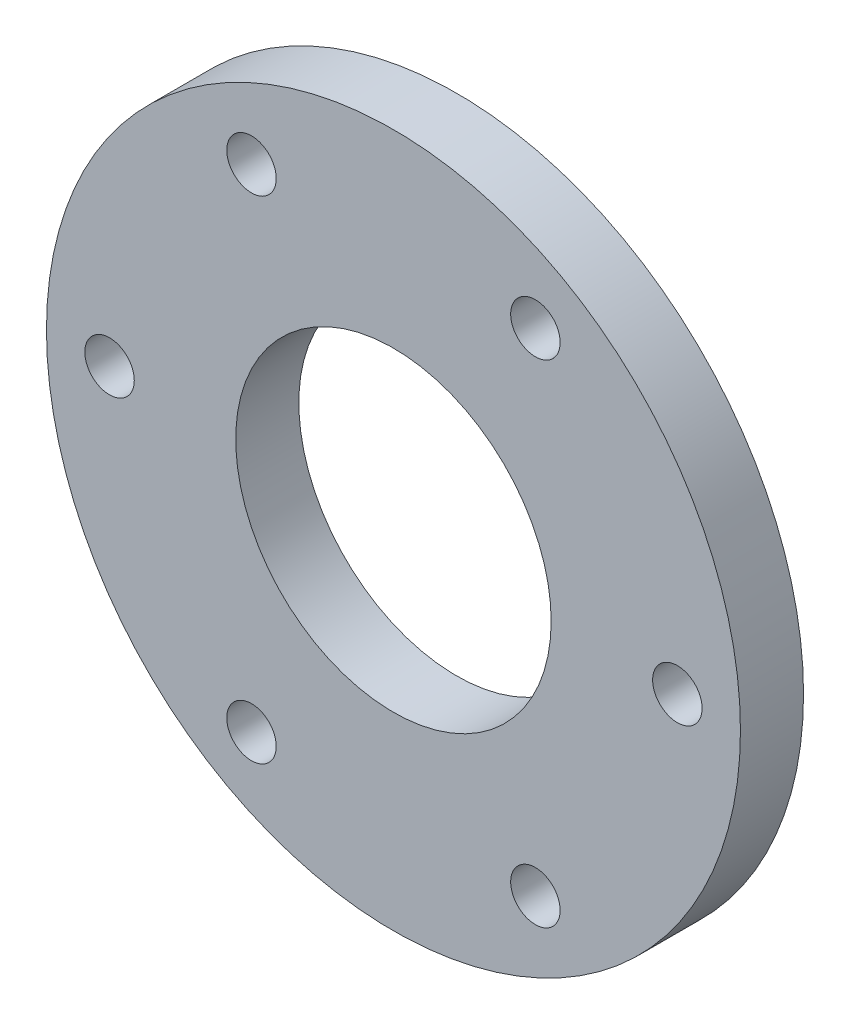
ISO-10303-21;
HEADER;
FILE_DESCRIPTION(('STEP AP214'),'2;1');
FILE_NAME('part.step','',(''),(''),'','','');
FILE_SCHEMA(('AUTOMOTIVE_DESIGN { 1 0 10303 214 1 1 1 1 }'));
ENDSEC;
DATA;
#1=APPLICATION_CONTEXT('core data for automotive mechanical design processes');
#2=APPLICATION_PROTOCOL_DEFINITION('international standard','automotive_design',2000,#1);
#3=PRODUCT_CONTEXT('',#1,'mechanical');
#4=PRODUCT('Part','Part','',(#3));
#5=PRODUCT_RELATED_PRODUCT_CATEGORY('part','',(#4));
#6=PRODUCT_DEFINITION_FORMATION('','',#4);
#7=PRODUCT_DEFINITION_CONTEXT('part definition',#1,'design');
#8=PRODUCT_DEFINITION('design','',#6,#7);
#9=PRODUCT_DEFINITION_SHAPE('','',#8);
#10=(LENGTH_UNIT() NAMED_UNIT(*) SI_UNIT(.MILLI.,.METRE.));
#11=(NAMED_UNIT(*) PLANE_ANGLE_UNIT() SI_UNIT($,.RADIAN.));
#12=(NAMED_UNIT(*) SI_UNIT($,.STERADIAN.) SOLID_ANGLE_UNIT());
#13=UNCERTAINTY_MEASURE_WITH_UNIT(LENGTH_MEASURE(1.E-05),#10,'distance_accuracy_value','');
#14=(GEOMETRIC_REPRESENTATION_CONTEXT(3) GLOBAL_UNCERTAINTY_ASSIGNED_CONTEXT((#13)) GLOBAL_UNIT_ASSIGNED_CONTEXT((#10,
#11,#12)) REPRESENTATION_CONTEXT('',''));
#15=CARTESIAN_POINT('',(0.,0.,0.));
#16=DIRECTION('',(0.,0.,1.));
#17=DIRECTION('',(1.,0.,0.));
#18=AXIS2_PLACEMENT_3D('',#15,#16,#17);
#19=CARTESIAN_POINT('',(0.,0.,3.175));
#20=DIRECTION('',(0.,0.,1.));
#21=DIRECTION('',(1.,0.,0.));
#22=AXIS2_PLACEMENT_3D('',#19,#20,#21);
#23=PLANE('',#22);
#24=CARTESIAN_POINT('',(14.2875,24.7466759131403,3.175));
#25=DIRECTION('',(0.,0.,1.));
#26=DIRECTION('',(1.,0.,0.));
#27=AXIS2_PLACEMENT_3D('',#24,#25,#26);
#28=CIRCLE('',#27,2.4892);
#29=CARTESIAN_POINT('',(16.7767,24.7466759131403,3.175));
#30=VERTEX_POINT('',#29);
#31=EDGE_CURVE('E73',#30,#30,#28,.T.);
#32=ORIENTED_EDGE('',*,*,#31,.F.);
#33=EDGE_LOOP('',(#32));
#34=FACE_BOUND('',#33,.T.);
#35=CARTESIAN_POINT('',(14.2875,-24.7466759131404,3.175));
#36=DIRECTION('',(0.,0.,1.));
#37=DIRECTION('',(1.,0.,0.));
#38=AXIS2_PLACEMENT_3D('',#35,#36,#37);
#39=CIRCLE('',#38,2.4892);
#40=CARTESIAN_POINT('',(16.7767,-24.7466759131404,3.175));
#41=VERTEX_POINT('',#40);
#42=EDGE_CURVE('E61',#41,#41,#39,.T.);
#43=ORIENTED_EDGE('',*,*,#42,.F.);
#44=EDGE_LOOP('',(#43));
#45=FACE_BOUND('',#44,.T.);
#46=CARTESIAN_POINT('',(-28.575,0.,3.175));
#47=DIRECTION('',(0.,0.,1.));
#48=DIRECTION('',(1.,0.,0.));
#49=AXIS2_PLACEMENT_3D('',#46,#47,#48);
#50=CIRCLE('',#49,2.4892);
#51=CARTESIAN_POINT('',(-26.0858,0.,3.175));
#52=VERTEX_POINT('',#51);
#53=EDGE_CURVE('E49',#52,#52,#50,.T.);
#54=ORIENTED_EDGE('',*,*,#53,.F.);
#55=EDGE_LOOP('',(#54));
#56=FACE_BOUND('',#55,.T.);
#57=CARTESIAN_POINT('',(0.,0.,3.175));
#58=DIRECTION('',(0.,0.,1.));
#59=DIRECTION('',(1.,0.,0.));
#60=AXIS2_PLACEMENT_3D('',#57,#58,#59);
#61=CIRCLE('',#60,34.925);
#62=CARTESIAN_POINT('',(34.925,0.,3.175));
#63=VERTEX_POINT('',#62);
#64=EDGE_CURVE('E10',#63,#63,#61,.T.);
#65=ORIENTED_EDGE('',*,*,#64,.T.);
#66=EDGE_LOOP('',(#65));
#67=FACE_BOUND('',#66,.T.);
#68=CARTESIAN_POINT('',(0.,0.,3.175));
#69=DIRECTION('',(0.,0.,1.));
#70=DIRECTION('',(1.,0.,0.));
#71=AXIS2_PLACEMENT_3D('',#68,#69,#70);
#72=CIRCLE('',#71,15.875);
#73=CARTESIAN_POINT('',(15.875,0.,3.175));
#74=VERTEX_POINT('',#73);
#75=EDGE_CURVE('E44',#74,#74,#72,.T.);
#76=ORIENTED_EDGE('',*,*,#75,.F.);
#77=EDGE_LOOP('',(#76));
#78=FACE_BOUND('',#77,.T.);
#79=CARTESIAN_POINT('',(-14.2875,-24.7466759131403,3.175));
#80=DIRECTION('',(0.,0.,1.));
#81=DIRECTION('',(1.,0.,0.));
#82=AXIS2_PLACEMENT_3D('',#79,#80,#81);
#83=CIRCLE('',#82,2.4892);
#84=CARTESIAN_POINT('',(-11.7983,-24.7466759131403,3.175));
#85=VERTEX_POINT('',#84);
#86=EDGE_CURVE('E55',#85,#85,#83,.T.);
#87=ORIENTED_EDGE('',*,*,#86,.F.);
#88=EDGE_LOOP('',(#87));
#89=FACE_BOUND('',#88,.T.);
#90=CARTESIAN_POINT('',(28.575,0.,3.175));
#91=DIRECTION('',(0.,0.,1.));
#92=DIRECTION('',(1.,0.,0.));
#93=AXIS2_PLACEMENT_3D('',#90,#91,#92);
#94=CIRCLE('',#93,2.4892);
#95=CARTESIAN_POINT('',(31.0642,0.,3.175));
#96=VERTEX_POINT('',#95);
#97=EDGE_CURVE('E67',#96,#96,#94,.T.);
#98=ORIENTED_EDGE('',*,*,#97,.F.);
#99=EDGE_LOOP('',(#98));
#100=FACE_BOUND('',#99,.T.);
#101=CARTESIAN_POINT('',(-14.2875,24.7466759131403,3.175));
#102=DIRECTION('',(0.,0.,1.));
#103=DIRECTION('',(1.,0.,0.));
#104=AXIS2_PLACEMENT_3D('',#101,#102,#103);
#105=CIRCLE('',#104,2.4892);
#106=CARTESIAN_POINT('',(-11.7983,24.7466759131403,3.175));
#107=VERTEX_POINT('',#106);
#108=EDGE_CURVE('E79',#107,#107,#105,.T.);
#109=ORIENTED_EDGE('',*,*,#108,.F.);
#110=EDGE_LOOP('',(#109));
#111=FACE_BOUND('',#110,.T.);
#112=ADVANCED_FACE('F33',(#34,#45,#56,#67,#78,#89,#100,#111),#23,.T.);
#113=CARTESIAN_POINT('',(0.,0.,-3.175));
#114=DIRECTION('',(0.,0.,1.));
#115=DIRECTION('',(1.,0.,0.));
#116=AXIS2_PLACEMENT_3D('',#113,#114,#115);
#117=PLANE('',#116);
#118=CARTESIAN_POINT('',(0.,0.,-3.175));
#119=DIRECTION('',(0.,0.,1.));
#120=DIRECTION('',(1.,0.,0.));
#121=AXIS2_PLACEMENT_3D('',#118,#119,#120);
#122=CIRCLE('',#121,34.925);
#123=CARTESIAN_POINT('',(34.925,0.,-3.175));
#124=VERTEX_POINT('',#123);
#125=EDGE_CURVE('E37',#124,#124,#122,.T.);
#126=ORIENTED_EDGE('',*,*,#125,.F.);
#127=EDGE_LOOP('',(#126));
#128=FACE_BOUND('',#127,.T.);
#129=CARTESIAN_POINT('',(0.,0.,-3.175));
#130=DIRECTION('',(0.,0.,1.));
#131=DIRECTION('',(1.,0.,0.));
#132=AXIS2_PLACEMENT_3D('',#129,#130,#131);
#133=CIRCLE('',#132,15.875);
#134=CARTESIAN_POINT('',(15.875,0.,-3.175));
#135=VERTEX_POINT('',#134);
#136=EDGE_CURVE('E46',#135,#135,#133,.T.);
#137=ORIENTED_EDGE('',*,*,#136,.T.);
#138=EDGE_LOOP('',(#137));
#139=FACE_BOUND('',#138,.T.);
#140=CARTESIAN_POINT('',(-28.575,0.,-3.175));
#141=DIRECTION('',(0.,0.,1.));
#142=DIRECTION('',(1.,0.,0.));
#143=AXIS2_PLACEMENT_3D('',#140,#141,#142);
#144=CIRCLE('',#143,2.4892);
#145=CARTESIAN_POINT('',(-26.0858,0.,-3.175));
#146=VERTEX_POINT('',#145);
#147=EDGE_CURVE('E52',#146,#146,#144,.T.);
#148=ORIENTED_EDGE('',*,*,#147,.T.);
#149=EDGE_LOOP('',(#148));
#150=FACE_BOUND('',#149,.T.);
#151=CARTESIAN_POINT('',(-14.2875,-24.7466759131403,-3.175));
#152=DIRECTION('',(0.,0.,1.));
#153=DIRECTION('',(1.,0.,0.));
#154=AXIS2_PLACEMENT_3D('',#151,#152,#153);
#155=CIRCLE('',#154,2.4892);
#156=CARTESIAN_POINT('',(-11.7983,-24.7466759131403,-3.175));
#157=VERTEX_POINT('',#156);
#158=EDGE_CURVE('E58',#157,#157,#155,.T.);
#159=ORIENTED_EDGE('',*,*,#158,.T.);
#160=EDGE_LOOP('',(#159));
#161=FACE_BOUND('',#160,.T.);
#162=CARTESIAN_POINT('',(14.2875,-24.7466759131404,-3.175));
#163=DIRECTION('',(0.,0.,1.));
#164=DIRECTION('',(1.,0.,0.));
#165=AXIS2_PLACEMENT_3D('',#162,#163,#164);
#166=CIRCLE('',#165,2.4892);
#167=CARTESIAN_POINT('',(16.7767,-24.7466759131404,-3.175));
#168=VERTEX_POINT('',#167);
#169=EDGE_CURVE('E64',#168,#168,#166,.T.);
#170=ORIENTED_EDGE('',*,*,#169,.T.);
#171=EDGE_LOOP('',(#170));
#172=FACE_BOUND('',#171,.T.);
#173=CARTESIAN_POINT('',(28.575,0.,-3.175));
#174=DIRECTION('',(0.,0.,1.));
#175=DIRECTION('',(1.,0.,0.));
#176=AXIS2_PLACEMENT_3D('',#173,#174,#175);
#177=CIRCLE('',#176,2.4892);
#178=CARTESIAN_POINT('',(31.0642,0.,-3.175));
#179=VERTEX_POINT('',#178);
#180=EDGE_CURVE('E70',#179,#179,#177,.T.);
#181=ORIENTED_EDGE('',*,*,#180,.T.);
#182=EDGE_LOOP('',(#181));
#183=FACE_BOUND('',#182,.T.);
#184=CARTESIAN_POINT('',(14.2875,24.7466759131403,-3.175));
#185=DIRECTION('',(0.,0.,1.));
#186=DIRECTION('',(1.,0.,0.));
#187=AXIS2_PLACEMENT_3D('',#184,#185,#186);
#188=CIRCLE('',#187,2.4892);
#189=CARTESIAN_POINT('',(16.7767,24.7466759131403,-3.175));
#190=VERTEX_POINT('',#189);
#191=EDGE_CURVE('E76',#190,#190,#188,.T.);
#192=ORIENTED_EDGE('',*,*,#191,.T.);
#193=EDGE_LOOP('',(#192));
#194=FACE_BOUND('',#193,.T.);
#195=CARTESIAN_POINT('',(-14.2875,24.7466759131403,-3.175));
#196=DIRECTION('',(0.,0.,1.));
#197=DIRECTION('',(1.,0.,0.));
#198=AXIS2_PLACEMENT_3D('',#195,#196,#197);
#199=CIRCLE('',#198,2.4892);
#200=CARTESIAN_POINT('',(-11.7983,24.7466759131403,-3.175));
#201=VERTEX_POINT('',#200);
#202=EDGE_CURVE('E82',#201,#201,#199,.T.);
#203=ORIENTED_EDGE('',*,*,#202,.T.);
#204=EDGE_LOOP('',(#203));
#205=FACE_BOUND('',#204,.T.);
#206=ADVANCED_FACE('F92',(#128,#139,#150,#161,#172,#183,#194,#205),#117,.F.);
#207=CARTESIAN_POINT('',(0.,0.,3.175));
#208=DIRECTION('',(0.,0.,-1.));
#209=DIRECTION('',(-1.,0.,0.));
#210=AXIS2_PLACEMENT_3D('',#207,#208,#209);
#211=CYLINDRICAL_SURFACE('',#210,34.925);
#212=ORIENTED_EDGE('',*,*,#64,.F.);
#213=EDGE_LOOP('',(#212));
#214=FACE_BOUND('',#213,.T.);
#215=ORIENTED_EDGE('',*,*,#125,.T.);
#216=EDGE_LOOP('',(#215));
#217=FACE_BOUND('',#216,.T.);
#218=ADVANCED_FACE('F35',(#214,#217),#211,.T.);
#219=CARTESIAN_POINT('',(0.,0.,3.175));
#220=DIRECTION('',(0.,0.,-1.));
#221=DIRECTION('',(-1.,0.,0.));
#222=AXIS2_PLACEMENT_3D('',#219,#220,#221);
#223=CYLINDRICAL_SURFACE('',#222,15.875);
#224=ORIENTED_EDGE('',*,*,#75,.T.);
#225=EDGE_LOOP('',(#224));
#226=FACE_BOUND('',#225,.T.);
#227=ORIENTED_EDGE('',*,*,#136,.F.);
#228=EDGE_LOOP('',(#227));
#229=FACE_BOUND('',#228,.T.);
#230=ADVANCED_FACE('F102',(#226,#229),#223,.F.);
#231=CARTESIAN_POINT('',(-28.575,0.,3.175));
#232=DIRECTION('',(0.,0.,-1.));
#233=DIRECTION('',(-1.,0.,0.));
#234=AXIS2_PLACEMENT_3D('',#231,#232,#233);
#235=CYLINDRICAL_SURFACE('',#234,2.4892);
#236=ORIENTED_EDGE('',*,*,#53,.T.);
#237=EDGE_LOOP('',(#236));
#238=FACE_BOUND('',#237,.T.);
#239=ORIENTED_EDGE('',*,*,#147,.F.);
#240=EDGE_LOOP('',(#239));
#241=FACE_BOUND('',#240,.T.);
#242=ADVANCED_FACE('F105',(#238,#241),#235,.F.);
#243=CARTESIAN_POINT('',(-14.2875,-24.7466759131403,3.175));
#244=DIRECTION('',(0.,0.,-1.));
#245=DIRECTION('',(-1.,0.,0.));
#246=AXIS2_PLACEMENT_3D('',#243,#244,#245);
#247=CYLINDRICAL_SURFACE('',#246,2.4892);
#248=ORIENTED_EDGE('',*,*,#86,.T.);
#249=EDGE_LOOP('',(#248));
#250=FACE_BOUND('',#249,.T.);
#251=ORIENTED_EDGE('',*,*,#158,.F.);
#252=EDGE_LOOP('',(#251));
#253=FACE_BOUND('',#252,.T.);
#254=ADVANCED_FACE('F109',(#250,#253),#247,.F.);
#255=CARTESIAN_POINT('',(14.2875,-24.7466759131404,3.175));
#256=DIRECTION('',(0.,0.,-1.));
#257=DIRECTION('',(-1.,0.,0.));
#258=AXIS2_PLACEMENT_3D('',#255,#256,#257);
#259=CYLINDRICAL_SURFACE('',#258,2.4892);
#260=ORIENTED_EDGE('',*,*,#42,.T.);
#261=EDGE_LOOP('',(#260));
#262=FACE_BOUND('',#261,.T.);
#263=ORIENTED_EDGE('',*,*,#169,.F.);
#264=EDGE_LOOP('',(#263));
#265=FACE_BOUND('',#264,.T.);
#266=ADVANCED_FACE('F113',(#262,#265),#259,.F.);
#267=CARTESIAN_POINT('',(28.575,0.,3.175));
#268=DIRECTION('',(0.,0.,-1.));
#269=DIRECTION('',(-1.,0.,0.));
#270=AXIS2_PLACEMENT_3D('',#267,#268,#269);
#271=CYLINDRICAL_SURFACE('',#270,2.4892);
#272=ORIENTED_EDGE('',*,*,#97,.T.);
#273=EDGE_LOOP('',(#272));
#274=FACE_BOUND('',#273,.T.);
#275=ORIENTED_EDGE('',*,*,#180,.F.);
#276=EDGE_LOOP('',(#275));
#277=FACE_BOUND('',#276,.T.);
#278=ADVANCED_FACE('F117',(#274,#277),#271,.F.);
#279=CARTESIAN_POINT('',(14.2875,24.7466759131403,3.175));
#280=DIRECTION('',(0.,0.,-1.));
#281=DIRECTION('',(-1.,0.,0.));
#282=AXIS2_PLACEMENT_3D('',#279,#280,#281);
#283=CYLINDRICAL_SURFACE('',#282,2.4892);
#284=ORIENTED_EDGE('',*,*,#31,.T.);
#285=EDGE_LOOP('',(#284));
#286=FACE_BOUND('',#285,.T.);
#287=ORIENTED_EDGE('',*,*,#191,.F.);
#288=EDGE_LOOP('',(#287));
#289=FACE_BOUND('',#288,.T.);
#290=ADVANCED_FACE('F121',(#286,#289),#283,.F.);
#291=CARTESIAN_POINT('',(-14.2875,24.7466759131403,3.175));
#292=DIRECTION('',(0.,0.,-1.));
#293=DIRECTION('',(-1.,0.,0.));
#294=AXIS2_PLACEMENT_3D('',#291,#292,#293);
#295=CYLINDRICAL_SURFACE('',#294,2.4892);
#296=ORIENTED_EDGE('',*,*,#108,.T.);
#297=EDGE_LOOP('',(#296));
#298=FACE_BOUND('',#297,.T.);
#299=ORIENTED_EDGE('',*,*,#202,.F.);
#300=EDGE_LOOP('',(#299));
#301=FACE_BOUND('',#300,.T.);
#302=ADVANCED_FACE('F88',(#298,#301),#295,.F.);
#303=CLOSED_SHELL('',(#112,#206,#218,#230,#242,#254,#266,#278,#290,#302));
#304=MANIFOLD_SOLID_BREP('B2',#303);
#305=ADVANCED_BREP_SHAPE_REPRESENTATION('',(#18,#304),#14);
#306=SHAPE_DEFINITION_REPRESENTATION(#9,#305);
ENDSEC;
END-ISO-10303-21;
